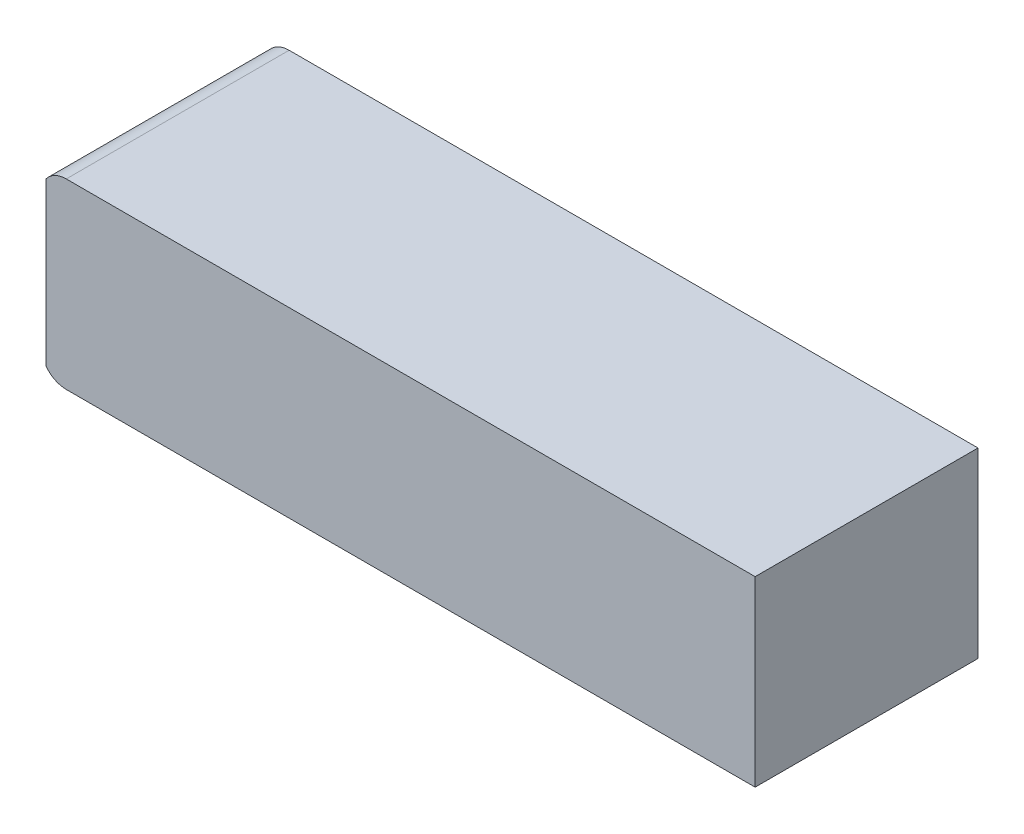
ISO-10303-21;
HEADER;
FILE_DESCRIPTION(('STEP AP214'),'2;1');
FILE_NAME('part.step','',(''),(''),'','','');
FILE_SCHEMA(('AUTOMOTIVE_DESIGN { 1 0 10303 214 1 1 1 1 }'));
ENDSEC;
DATA;
#1=APPLICATION_CONTEXT('core data for automotive mechanical design processes');
#2=APPLICATION_PROTOCOL_DEFINITION('international standard','automotive_design',2000,#1);
#3=PRODUCT_CONTEXT('',#1,'mechanical');
#4=PRODUCT('Part','Part','',(#3));
#5=PRODUCT_RELATED_PRODUCT_CATEGORY('part','',(#4));
#6=PRODUCT_DEFINITION_FORMATION('','',#4);
#7=PRODUCT_DEFINITION_CONTEXT('part definition',#1,'design');
#8=PRODUCT_DEFINITION('design','',#6,#7);
#9=PRODUCT_DEFINITION_SHAPE('','',#8);
#10=(LENGTH_UNIT() NAMED_UNIT(*) SI_UNIT(.MILLI.,.METRE.));
#11=(NAMED_UNIT(*) PLANE_ANGLE_UNIT() SI_UNIT($,.RADIAN.));
#12=(NAMED_UNIT(*) SI_UNIT($,.STERADIAN.) SOLID_ANGLE_UNIT());
#13=UNCERTAINTY_MEASURE_WITH_UNIT(LENGTH_MEASURE(1.E-05),#10,'distance_accuracy_value','');
#14=(GEOMETRIC_REPRESENTATION_CONTEXT(3) GLOBAL_UNCERTAINTY_ASSIGNED_CONTEXT((#13)) GLOBAL_UNIT_ASSIGNED_CONTEXT((#10,
#11,#12)) REPRESENTATION_CONTEXT('',''));
#15=CARTESIAN_POINT('',(0.,0.,0.));
#16=DIRECTION('',(0.,0.,1.));
#17=DIRECTION('',(1.,0.,0.));
#18=AXIS2_PLACEMENT_3D('',#15,#16,#17);
#19=CARTESIAN_POINT('',(70.5,36.,22.));
#20=DIRECTION('',(-1.,0.,0.));
#21=DIRECTION('',(0.,0.,1.));
#22=AXIS2_PLACEMENT_3D('',#19,#20,#21);
#23=PLANE('',#22);
#24=DIRECTION('',(0.,0.,-1.));
#25=VECTOR('',#24,1.);
#26=CARTESIAN_POINT('',(70.5,0.,22.));
#27=LINE('',#26,#25);
#28=CARTESIAN_POINT('',(70.5,0.,22.));
#29=VERTEX_POINT('',#28);
#30=CARTESIAN_POINT('',(70.5,0.,-22.));
#31=VERTEX_POINT('',#30);
#32=EDGE_CURVE('E121',#29,#31,#27,.T.);
#33=ORIENTED_EDGE('',*,*,#32,.T.);
#34=DIRECTION('',(0.,-1.,0.));
#35=VECTOR('',#34,1.);
#36=CARTESIAN_POINT('',(70.5,36.,-22.));
#37=LINE('',#36,#35);
#38=CARTESIAN_POINT('',(70.5,36.,-22.));
#39=VERTEX_POINT('',#38);
#40=EDGE_CURVE('E101',#39,#31,#37,.T.);
#41=ORIENTED_EDGE('',*,*,#40,.F.);
#42=DIRECTION('',(0.,0.,-1.));
#43=VECTOR('',#42,1.);
#44=CARTESIAN_POINT('',(70.5,36.,22.));
#45=LINE('',#44,#43);
#46=CARTESIAN_POINT('',(70.5,36.,22.));
#47=VERTEX_POINT('',#46);
#48=EDGE_CURVE('E110',#47,#39,#45,.T.);
#49=ORIENTED_EDGE('',*,*,#48,.F.);
#50=DIRECTION('',(0.,-1.,0.));
#51=VECTOR('',#50,1.);
#52=CARTESIAN_POINT('',(70.5,36.,22.));
#53=LINE('',#52,#51);
#54=EDGE_CURVE('E128',#47,#29,#53,.T.);
#55=ORIENTED_EDGE('',*,*,#54,.T.);
#56=EDGE_LOOP('',(#33,#41,#49,#55));
#57=FACE_BOUND('',#56,.T.);
#58=ADVANCED_FACE('F38',(#57),#23,.F.);
#59=CARTESIAN_POINT('',(-70.5,36.,-22.));
#60=DIRECTION('',(0.,0.,1.));
#61=DIRECTION('',(1.,0.,0.));
#62=AXIS2_PLACEMENT_3D('',#59,#60,#61);
#63=PLANE('',#62);
#64=DIRECTION('',(-1.,0.,0.));
#65=VECTOR('',#64,1.);
#66=CARTESIAN_POINT('',(-70.5,0.,-22.));
#67=LINE('',#66,#65);
#68=CARTESIAN_POINT('',(-65.5,0.,-22.));
#69=VERTEX_POINT('',#68);
#70=EDGE_CURVE('E159',#31,#69,#67,.T.);
#71=ORIENTED_EDGE('',*,*,#70,.T.);
#72=CARTESIAN_POINT('',(-65.5,5.,-22.));
#73=DIRECTION('',(0.,0.,1.));
#74=DIRECTION('',(1.,0.,0.));
#75=AXIS2_PLACEMENT_3D('',#72,#73,#74);
#76=CIRCLE('',#75,5.);
#77=CARTESIAN_POINT('',(-70.5,5.,-22.));
#78=VERTEX_POINT('',#77);
#79=EDGE_CURVE('E141',#69,#78,#76,.F.);
#80=ORIENTED_EDGE('',*,*,#79,.T.);
#81=DIRECTION('',(0.,-1.,0.));
#82=VECTOR('',#81,1.);
#83=CARTESIAN_POINT('',(-70.5,36.,-22.));
#84=LINE('',#83,#82);
#85=CARTESIAN_POINT('',(-70.5,31.,-22.));
#86=VERTEX_POINT('',#85);
#87=EDGE_CURVE('E123',#86,#78,#84,.T.);
#88=ORIENTED_EDGE('',*,*,#87,.F.);
#89=CARTESIAN_POINT('',(-65.5,31.,-22.));
#90=DIRECTION('',(0.,0.,1.));
#91=DIRECTION('',(1.,0.,0.));
#92=AXIS2_PLACEMENT_3D('',#89,#90,#91);
#93=CIRCLE('',#92,5.);
#94=CARTESIAN_POINT('',(-65.5,36.,-22.));
#95=VERTEX_POINT('',#94);
#96=EDGE_CURVE('E105',#86,#95,#93,.F.);
#97=ORIENTED_EDGE('',*,*,#96,.T.);
#98=DIRECTION('',(-1.,0.,0.));
#99=VECTOR('',#98,1.);
#100=CARTESIAN_POINT('',(-70.5,36.,-22.));
#101=LINE('',#100,#99);
#102=EDGE_CURVE('E96',#39,#95,#101,.T.);
#103=ORIENTED_EDGE('',*,*,#102,.F.);
#104=ORIENTED_EDGE('',*,*,#40,.T.);
#105=EDGE_LOOP('',(#71,#80,#88,#97,#103,#104));
#106=FACE_BOUND('',#105,.T.);
#107=ADVANCED_FACE('F99',(#106),#63,.F.);
#108=CARTESIAN_POINT('',(-70.5,36.,22.));
#109=DIRECTION('',(1.,0.,0.));
#110=DIRECTION('',(0.,0.,-1.));
#111=AXIS2_PLACEMENT_3D('',#108,#109,#110);
#112=PLANE('',#111);
#113=DIRECTION('',(0.,0.,1.));
#114=VECTOR('',#113,1.);
#115=CARTESIAN_POINT('',(-70.5,5.,22.));
#116=LINE('',#115,#114);
#117=CARTESIAN_POINT('',(-70.5,5.,21.));
#118=VERTEX_POINT('',#117);
#119=EDGE_CURVE('E125',#78,#118,#116,.T.);
#120=ORIENTED_EDGE('',*,*,#119,.T.);
#121=DIRECTION('',(0.,1.,0.));
#122=VECTOR('',#121,1.);
#123=CARTESIAN_POINT('',(-70.5,36.,21.));
#124=LINE('',#123,#122);
#125=CARTESIAN_POINT('',(-70.5,31.,21.));
#126=VERTEX_POINT('',#125);
#127=EDGE_CURVE('E46',#118,#126,#124,.T.);
#128=ORIENTED_EDGE('',*,*,#127,.T.);
#129=DIRECTION('',(0.,0.,1.));
#130=VECTOR('',#129,1.);
#131=CARTESIAN_POINT('',(-70.5,31.,22.));
#132=LINE('',#131,#130);
#133=EDGE_CURVE('E122',#126,#86,#132,.F.);
#134=ORIENTED_EDGE('',*,*,#133,.T.);
#135=ORIENTED_EDGE('',*,*,#87,.T.);
#136=EDGE_LOOP('',(#120,#128,#134,#135));
#137=FACE_BOUND('',#136,.T.);
#138=ADVANCED_FACE('F164',(#137),#112,.F.);
#139=CARTESIAN_POINT('',(-70.5,36.,22.));
#140=DIRECTION('',(0.,0.,-1.));
#141=DIRECTION('',(-1.,0.,0.));
#142=AXIS2_PLACEMENT_3D('',#139,#140,#141);
#143=PLANE('',#142);
#144=CARTESIAN_POINT('',(-65.5,31.,22.));
#145=DIRECTION('',(0.,0.,-1.));
#146=DIRECTION('',(-1.,0.,0.));
#147=AXIS2_PLACEMENT_3D('',#144,#145,#146);
#148=CIRCLE('',#147,5.);
#149=CARTESIAN_POINT('',(-65.5,36.,22.));
#150=VERTEX_POINT('',#149);
#151=CARTESIAN_POINT('',(-69.5,34.,22.));
#152=VERTEX_POINT('',#151);
#153=EDGE_CURVE('E133',#150,#152,#148,.F.);
#154=ORIENTED_EDGE('',*,*,#153,.T.);
#155=DIRECTION('',(0.,-1.,0.));
#156=VECTOR('',#155,1.);
#157=CARTESIAN_POINT('',(-69.5,36.,22.));
#158=LINE('',#157,#156);
#159=CARTESIAN_POINT('',(-69.5,2.00000000000001,22.));
#160=VERTEX_POINT('',#159);
#161=EDGE_CURVE('E145',#152,#160,#158,.T.);
#162=ORIENTED_EDGE('',*,*,#161,.T.);
#163=CARTESIAN_POINT('',(-65.5,5.,22.));
#164=DIRECTION('',(0.,0.,-1.));
#165=DIRECTION('',(-1.,0.,0.));
#166=AXIS2_PLACEMENT_3D('',#163,#164,#165);
#167=CIRCLE('',#166,5.);
#168=CARTESIAN_POINT('',(-65.5,0.,22.));
#169=VERTEX_POINT('',#168);
#170=EDGE_CURVE('E136',#160,#169,#167,.F.);
#171=ORIENTED_EDGE('',*,*,#170,.T.);
#172=DIRECTION('',(1.,0.,0.));
#173=VECTOR('',#172,1.);
#174=CARTESIAN_POINT('',(-70.5,0.,22.));
#175=LINE('',#174,#173);
#176=EDGE_CURVE('E118',#169,#29,#175,.T.);
#177=ORIENTED_EDGE('',*,*,#176,.T.);
#178=ORIENTED_EDGE('',*,*,#54,.F.);
#179=DIRECTION('',(1.,0.,0.));
#180=VECTOR('',#179,1.);
#181=CARTESIAN_POINT('',(-70.5,36.,22.));
#182=LINE('',#181,#180);
#183=EDGE_CURVE('E109',#150,#47,#182,.T.);
#184=ORIENTED_EDGE('',*,*,#183,.F.);
#185=EDGE_LOOP('',(#154,#162,#171,#177,#178,#184));
#186=FACE_BOUND('',#185,.T.);
#187=ADVANCED_FACE('F150',(#186),#143,.F.);
#188=CARTESIAN_POINT('',(0.,36.,0.));
#189=DIRECTION('',(0.,-1.,0.));
#190=DIRECTION('',(0.,0.,-1.));
#191=AXIS2_PLACEMENT_3D('',#188,#189,#190);
#192=PLANE('',#191);
#193=ORIENTED_EDGE('',*,*,#102,.T.);
#194=DIRECTION('',(0.,0.,1.));
#195=VECTOR('',#194,1.);
#196=CARTESIAN_POINT('',(-65.5,36.,0.));
#197=LINE('',#196,#195);
#198=EDGE_CURVE('E143',#95,#150,#197,.T.);
#199=ORIENTED_EDGE('',*,*,#198,.T.);
#200=ORIENTED_EDGE('',*,*,#183,.T.);
#201=ORIENTED_EDGE('',*,*,#48,.T.);
#202=EDGE_LOOP('',(#193,#199,#200,#201));
#203=FACE_BOUND('',#202,.T.);
#204=ADVANCED_FACE('F113',(#203),#192,.F.);
#205=CARTESIAN_POINT('',(0.,0.,0.));
#206=DIRECTION('',(0.,-1.,0.));
#207=DIRECTION('',(0.,0.,-1.));
#208=AXIS2_PLACEMENT_3D('',#205,#206,#207);
#209=PLANE('',#208);
#210=ORIENTED_EDGE('',*,*,#176,.F.);
#211=DIRECTION('',(0.,0.,1.));
#212=VECTOR('',#211,1.);
#213=CARTESIAN_POINT('',(-65.5,0.,-22.));
#214=LINE('',#213,#212);
#215=EDGE_CURVE('E138',#169,#69,#214,.F.);
#216=ORIENTED_EDGE('',*,*,#215,.T.);
#217=ORIENTED_EDGE('',*,*,#70,.F.);
#218=ORIENTED_EDGE('',*,*,#32,.F.);
#219=EDGE_LOOP('',(#210,#216,#217,#218));
#220=FACE_BOUND('',#219,.T.);
#221=ADVANCED_FACE('F158',(#220),#209,.T.);
#222=CARTESIAN_POINT('',(-65.5,5.,22.));
#223=DIRECTION('',(0.,0.,-1.));
#224=DIRECTION('',(-1.,0.,0.));
#225=AXIS2_PLACEMENT_3D('',#222,#223,#224);
#226=CYLINDRICAL_SURFACE('',#225,5.);
#227=ORIENTED_EDGE('',*,*,#170,.F.);
#228=CARTESIAN_POINT('',(-65.5,5.,26.));
#229=DIRECTION('',(0.707106781186547,0.,-0.707106781186547));
#230=DIRECTION('',(-0.707106781186548,0.,-0.707106781186548));
#231=AXIS2_PLACEMENT_3D('',#228,#229,#230);
#232=ELLIPSE('',#231,7.07106781186548,5.);
#233=EDGE_CURVE('E60',#160,#118,#232,.T.);
#234=ORIENTED_EDGE('',*,*,#233,.T.);
#235=ORIENTED_EDGE('',*,*,#119,.F.);
#236=ORIENTED_EDGE('',*,*,#79,.F.);
#237=ORIENTED_EDGE('',*,*,#215,.F.);
#238=EDGE_LOOP('',(#227,#234,#235,#236,#237));
#239=FACE_BOUND('',#238,.T.);
#240=ADVANCED_FACE('F155',(#239),#226,.T.);
#241=CARTESIAN_POINT('',(-65.5,31.,0.));
#242=DIRECTION('',(0.,0.,1.));
#243=DIRECTION('',(1.,0.,0.));
#244=AXIS2_PLACEMENT_3D('',#241,#242,#243);
#245=CYLINDRICAL_SURFACE('',#244,5.);
#246=ORIENTED_EDGE('',*,*,#133,.F.);
#247=CARTESIAN_POINT('',(-65.5,31.,26.));
#248=DIRECTION('',(0.707106781186547,0.,-0.707106781186547));
#249=DIRECTION('',(0.707106781186548,0.,0.707106781186548));
#250=AXIS2_PLACEMENT_3D('',#247,#248,#249);
#251=ELLIPSE('',#250,7.07106781186548,5.);
#252=EDGE_CURVE('E11',#126,#152,#251,.T.);
#253=ORIENTED_EDGE('',*,*,#252,.T.);
#254=ORIENTED_EDGE('',*,*,#153,.F.);
#255=ORIENTED_EDGE('',*,*,#198,.F.);
#256=ORIENTED_EDGE('',*,*,#96,.F.);
#257=EDGE_LOOP('',(#246,#253,#254,#255,#256));
#258=FACE_BOUND('',#257,.T.);
#259=ADVANCED_FACE('F166',(#258),#245,.T.);
#260=CARTESIAN_POINT('',(-69.5,36.,22.));
#261=DIRECTION('',(0.707106781186547,0.,-0.707106781186547));
#262=DIRECTION('',(0.,-1.,0.));
#263=AXIS2_PLACEMENT_3D('',#260,#261,#262);
#264=PLANE('',#263);
#265=ORIENTED_EDGE('',*,*,#252,.F.);
#266=ORIENTED_EDGE('',*,*,#127,.F.);
#267=ORIENTED_EDGE('',*,*,#233,.F.);
#268=ORIENTED_EDGE('',*,*,#161,.F.);
#269=EDGE_LOOP('',(#265,#266,#267,#268));
#270=FACE_BOUND('',#269,.T.);
#271=ADVANCED_FACE('F40',(#270),#264,.F.);
#272=CLOSED_SHELL('',(#58,#107,#138,#187,#204,#221,#240,#259,#271));
#273=MANIFOLD_SOLID_BREP('B2',#272);
#274=ADVANCED_BREP_SHAPE_REPRESENTATION('',(#18,#273),#14);
#275=SHAPE_DEFINITION_REPRESENTATION(#9,#274);
ENDSEC;
END-ISO-10303-21;
